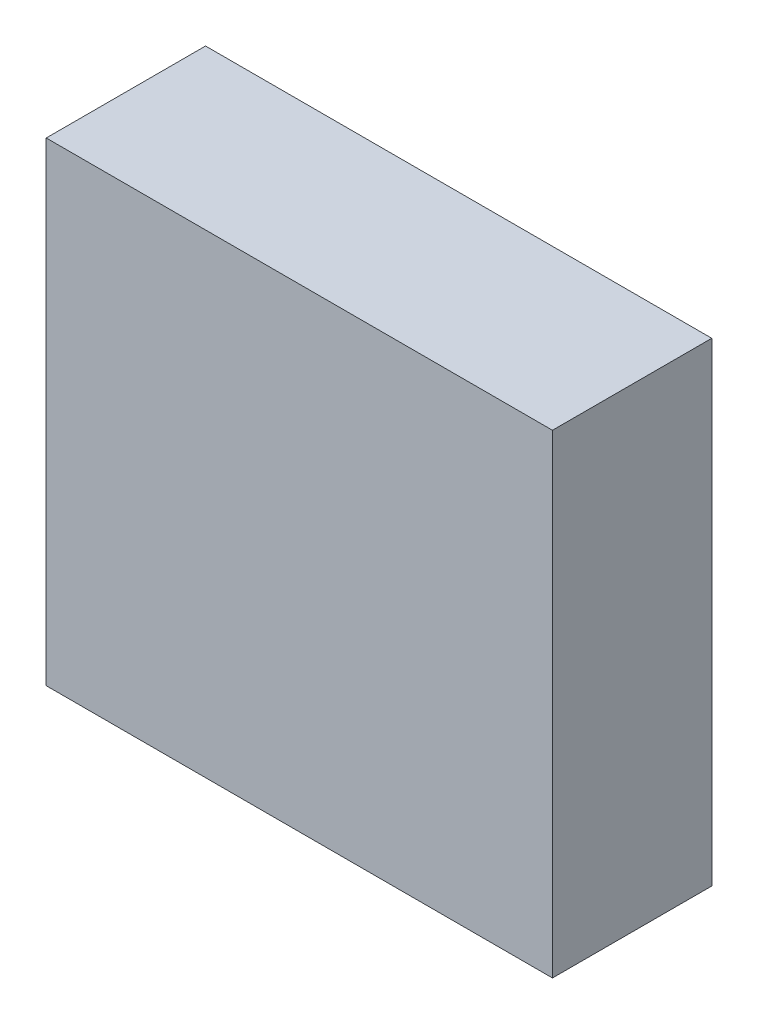
ISO-10303-21;
HEADER;
FILE_DESCRIPTION(('STEP AP214'),'2;1');
FILE_NAME('part.step','',(''),(''),'','','');
FILE_SCHEMA(('AUTOMOTIVE_DESIGN { 1 0 10303 214 1 1 1 1 }'));
ENDSEC;
DATA;
#1=APPLICATION_CONTEXT('core data for automotive mechanical design processes');
#2=APPLICATION_PROTOCOL_DEFINITION('international standard','automotive_design',2000,#1);
#3=PRODUCT_CONTEXT('',#1,'mechanical');
#4=PRODUCT('Part','Part','',(#3));
#5=PRODUCT_RELATED_PRODUCT_CATEGORY('part','',(#4));
#6=PRODUCT_DEFINITION_FORMATION('','',#4);
#7=PRODUCT_DEFINITION_CONTEXT('part definition',#1,'design');
#8=PRODUCT_DEFINITION('design','',#6,#7);
#9=PRODUCT_DEFINITION_SHAPE('','',#8);
#10=(LENGTH_UNIT() NAMED_UNIT(*) SI_UNIT(.MILLI.,.METRE.));
#11=(NAMED_UNIT(*) PLANE_ANGLE_UNIT() SI_UNIT($,.RADIAN.));
#12=(NAMED_UNIT(*) SI_UNIT($,.STERADIAN.) SOLID_ANGLE_UNIT());
#13=UNCERTAINTY_MEASURE_WITH_UNIT(LENGTH_MEASURE(1.E-05),#10,'distance_accuracy_value','');
#14=(GEOMETRIC_REPRESENTATION_CONTEXT(3) GLOBAL_UNCERTAINTY_ASSIGNED_CONTEXT((#13)) GLOBAL_UNIT_ASSIGNED_CONTEXT((#10,
#11,#12)) REPRESENTATION_CONTEXT('',''));
#15=CARTESIAN_POINT('',(0.,0.,0.));
#16=DIRECTION('',(0.,0.,1.));
#17=DIRECTION('',(1.,0.,0.));
#18=AXIS2_PLACEMENT_3D('',#15,#16,#17);
#19=CARTESIAN_POINT('',(-0.71499984,0.6700012,0.45000164));
#20=DIRECTION('',(0.,0.,-1.));
#21=DIRECTION('',(-1.,0.,0.));
#22=AXIS2_PLACEMENT_3D('',#19,#20,#21);
#23=PLANE('',#22);
#24=DIRECTION('',(1.,0.,0.));
#25=VECTOR('',#24,1.);
#26=CARTESIAN_POINT('',(-0.71499984,-0.66999866,0.45000164));
#27=LINE('',#26,#25);
#28=CARTESIAN_POINT('',(-0.71499984,-0.66999866,0.45000164));
#29=VERTEX_POINT('',#28);
#30=CARTESIAN_POINT('',(0.71499984,-0.66999866,0.45000164));
#31=VERTEX_POINT('',#30);
#32=EDGE_CURVE('E55',#29,#31,#27,.T.);
#33=ORIENTED_EDGE('',*,*,#32,.T.);
#34=DIRECTION('',(0.,1.,0.));
#35=VECTOR('',#34,1.);
#36=CARTESIAN_POINT('',(0.71499984,-0.66999866,0.45000164));
#37=LINE('',#36,#35);
#38=CARTESIAN_POINT('',(0.71499984,0.6700012,0.45000164));
#39=VERTEX_POINT('',#38);
#40=EDGE_CURVE('E57',#31,#39,#37,.T.);
#41=ORIENTED_EDGE('',*,*,#40,.T.);
#42=DIRECTION('',(1.,0.,0.));
#43=VECTOR('',#42,1.);
#44=CARTESIAN_POINT('',(0.71499984,0.6700012,0.45000164));
#45=LINE('',#44,#43);
#46=CARTESIAN_POINT('',(-0.71499984,0.6700012,0.45000164));
#47=VERTEX_POINT('',#46);
#48=EDGE_CURVE('E20',#39,#47,#45,.F.);
#49=ORIENTED_EDGE('',*,*,#48,.T.);
#50=DIRECTION('',(0.,1.,0.));
#51=VECTOR('',#50,1.);
#52=CARTESIAN_POINT('',(-0.71499984,0.6700012,0.45000164));
#53=LINE('',#52,#51);
#54=EDGE_CURVE('E80',#47,#29,#53,.F.);
#55=ORIENTED_EDGE('',*,*,#54,.T.);
#56=EDGE_LOOP('',(#33,#41,#49,#55));
#57=FACE_BOUND('',#56,.T.);
#58=ADVANCED_FACE('F17',(#57),#23,.F.);
#59=CARTESIAN_POINT('',(0.71499984,0.6700012,0.));
#60=DIRECTION('',(0.,-1.,0.));
#61=DIRECTION('',(0.,0.,-1.));
#62=AXIS2_PLACEMENT_3D('',#59,#60,#61);
#63=PLANE('',#62);
#64=DIRECTION('',(0.,0.,-1.));
#65=VECTOR('',#64,1.);
#66=CARTESIAN_POINT('',(-0.71499984,0.6700012,0.));
#67=LINE('',#66,#65);
#68=CARTESIAN_POINT('',(-0.71499984,0.6700012,0.));
#69=VERTEX_POINT('',#68);
#70=EDGE_CURVE('E68',#69,#47,#67,.F.);
#71=ORIENTED_EDGE('',*,*,#70,.T.);
#72=ORIENTED_EDGE('',*,*,#48,.F.);
#73=DIRECTION('',(0.,0.,1.));
#74=VECTOR('',#73,1.);
#75=CARTESIAN_POINT('',(0.71499984,0.6700012,0.));
#76=LINE('',#75,#74);
#77=CARTESIAN_POINT('',(0.71499984,0.6700012,0.));
#78=VERTEX_POINT('',#77);
#79=EDGE_CURVE('E63',#39,#78,#76,.F.);
#80=ORIENTED_EDGE('',*,*,#79,.T.);
#81=DIRECTION('',(-1.,0.,0.));
#82=VECTOR('',#81,1.);
#83=CARTESIAN_POINT('',(-0.71499984,0.6700012,0.));
#84=LINE('',#83,#82);
#85=EDGE_CURVE('E83',#69,#78,#84,.F.);
#86=ORIENTED_EDGE('',*,*,#85,.F.);
#87=EDGE_LOOP('',(#71,#72,#80,#86));
#88=FACE_BOUND('',#87,.T.);
#89=ADVANCED_FACE('F65',(#88),#63,.F.);
#90=CARTESIAN_POINT('',(0.71499984,-0.66999866,0.));
#91=DIRECTION('',(-1.,0.,0.));
#92=DIRECTION('',(0.,0.,1.));
#93=AXIS2_PLACEMENT_3D('',#90,#91,#92);
#94=PLANE('',#93);
#95=ORIENTED_EDGE('',*,*,#79,.F.);
#96=ORIENTED_EDGE('',*,*,#40,.F.);
#97=DIRECTION('',(0.,0.,1.));
#98=VECTOR('',#97,1.);
#99=CARTESIAN_POINT('',(0.71499984,-0.66999866,0.));
#100=LINE('',#99,#98);
#101=CARTESIAN_POINT('',(0.71499984,-0.66999866,0.));
#102=VERTEX_POINT('',#101);
#103=EDGE_CURVE('E75',#31,#102,#100,.F.);
#104=ORIENTED_EDGE('',*,*,#103,.T.);
#105=DIRECTION('',(0.,1.,0.));
#106=VECTOR('',#105,1.);
#107=CARTESIAN_POINT('',(0.71499984,0.6700012,0.));
#108=LINE('',#107,#106);
#109=EDGE_CURVE('E72',#78,#102,#108,.F.);
#110=ORIENTED_EDGE('',*,*,#109,.F.);
#111=EDGE_LOOP('',(#95,#96,#104,#110));
#112=FACE_BOUND('',#111,.T.);
#113=ADVANCED_FACE('F70',(#112),#94,.F.);
#114=CARTESIAN_POINT('',(-0.71499984,-0.66999866,0.));
#115=DIRECTION('',(0.,1.,0.));
#116=DIRECTION('',(0.,0.,1.));
#117=AXIS2_PLACEMENT_3D('',#114,#115,#116);
#118=PLANE('',#117);
#119=ORIENTED_EDGE('',*,*,#103,.F.);
#120=ORIENTED_EDGE('',*,*,#32,.F.);
#121=DIRECTION('',(0.,0.,-1.));
#122=VECTOR('',#121,1.);
#123=CARTESIAN_POINT('',(-0.71499984,-0.66999866,0.));
#124=LINE('',#123,#122);
#125=CARTESIAN_POINT('',(-0.71499984,-0.66999866,0.));
#126=VERTEX_POINT('',#125);
#127=EDGE_CURVE('E35',#29,#126,#124,.T.);
#128=ORIENTED_EDGE('',*,*,#127,.T.);
#129=DIRECTION('',(-1.,0.,0.));
#130=VECTOR('',#129,1.);
#131=CARTESIAN_POINT('',(-0.71499984,-0.66999866,0.));
#132=LINE('',#131,#130);
#133=EDGE_CURVE('E26',#102,#126,#132,.T.);
#134=ORIENTED_EDGE('',*,*,#133,.F.);
#135=EDGE_LOOP('',(#119,#120,#128,#134));
#136=FACE_BOUND('',#135,.T.);
#137=ADVANCED_FACE('F89',(#136),#118,.F.);
#138=CARTESIAN_POINT('',(-0.71499984,0.6700012,0.));
#139=DIRECTION('',(1.,0.,0.));
#140=DIRECTION('',(0.,0.,-1.));
#141=AXIS2_PLACEMENT_3D('',#138,#139,#140);
#142=PLANE('',#141);
#143=ORIENTED_EDGE('',*,*,#127,.F.);
#144=ORIENTED_EDGE('',*,*,#54,.F.);
#145=ORIENTED_EDGE('',*,*,#70,.F.);
#146=DIRECTION('',(0.,1.,0.));
#147=VECTOR('',#146,1.);
#148=CARTESIAN_POINT('',(-0.71499984,0.6700012,0.));
#149=LINE('',#148,#147);
#150=EDGE_CURVE('E11',#126,#69,#149,.T.);
#151=ORIENTED_EDGE('',*,*,#150,.F.);
#152=EDGE_LOOP('',(#143,#144,#145,#151));
#153=FACE_BOUND('',#152,.T.);
#154=ADVANCED_FACE('F91',(#153),#142,.F.);
#155=CARTESIAN_POINT('',(-0.71499984,0.6700012,0.));
#156=DIRECTION('',(0.,0.,-1.));
#157=DIRECTION('',(-1.,0.,0.));
#158=AXIS2_PLACEMENT_3D('',#155,#156,#157);
#159=PLANE('',#158);
#160=ORIENTED_EDGE('',*,*,#133,.T.);
#161=ORIENTED_EDGE('',*,*,#150,.T.);
#162=ORIENTED_EDGE('',*,*,#85,.T.);
#163=ORIENTED_EDGE('',*,*,#109,.T.);
#164=EDGE_LOOP('',(#160,#161,#162,#163));
#165=FACE_BOUND('',#164,.T.);
#166=ADVANCED_FACE('F88',(#165),#159,.T.);
#167=CLOSED_SHELL('',(#58,#89,#113,#137,#154,#166));
#168=MANIFOLD_SOLID_BREP('B1',#167);
#169=ADVANCED_BREP_SHAPE_REPRESENTATION('',(#18,#168),#14);
#170=SHAPE_DEFINITION_REPRESENTATION(#9,#169);
ENDSEC;
END-ISO-10303-21;
